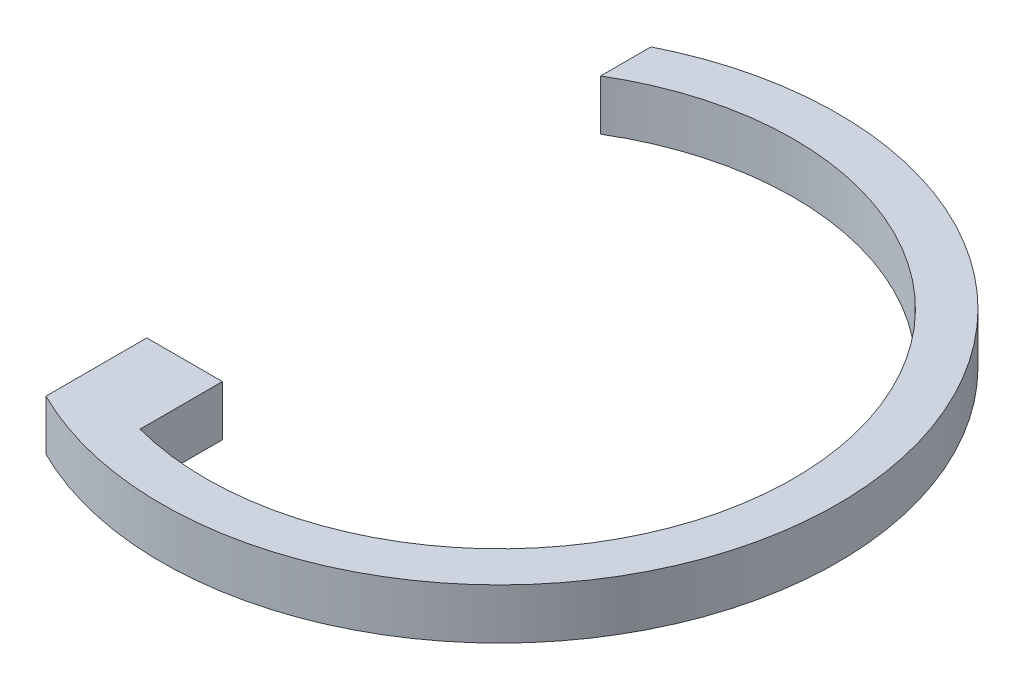
ISO-10303-21;
HEADER;
FILE_DESCRIPTION(('STEP AP214'),'2;1');
FILE_NAME('part.step','',(''),(''),'','','');
FILE_SCHEMA(('AUTOMOTIVE_DESIGN { 1 0 10303 214 1 1 1 1 }'));
ENDSEC;
DATA;
#1=APPLICATION_CONTEXT('core data for automotive mechanical design processes');
#2=APPLICATION_PROTOCOL_DEFINITION('international standard','automotive_design',2000,#1);
#3=PRODUCT_CONTEXT('',#1,'mechanical');
#4=PRODUCT('Part','Part','',(#3));
#5=PRODUCT_RELATED_PRODUCT_CATEGORY('part','',(#4));
#6=PRODUCT_DEFINITION_FORMATION('','',#4);
#7=PRODUCT_DEFINITION_CONTEXT('part definition',#1,'design');
#8=PRODUCT_DEFINITION('design','',#6,#7);
#9=PRODUCT_DEFINITION_SHAPE('','',#8);
#10=(LENGTH_UNIT() NAMED_UNIT(*) SI_UNIT(.MILLI.,.METRE.));
#11=(NAMED_UNIT(*) PLANE_ANGLE_UNIT() SI_UNIT($,.RADIAN.));
#12=(NAMED_UNIT(*) SI_UNIT($,.STERADIAN.) SOLID_ANGLE_UNIT());
#13=UNCERTAINTY_MEASURE_WITH_UNIT(LENGTH_MEASURE(1.E-05),#10,'distance_accuracy_value','');
#14=(GEOMETRIC_REPRESENTATION_CONTEXT(3) GLOBAL_UNCERTAINTY_ASSIGNED_CONTEXT((#13)) GLOBAL_UNIT_ASSIGNED_CONTEXT((#10,
#11,#12)) REPRESENTATION_CONTEXT('',''));
#15=CARTESIAN_POINT('',(0.,0.,0.));
#16=DIRECTION('',(0.,0.,1.));
#17=DIRECTION('',(1.,0.,0.));
#18=AXIS2_PLACEMENT_3D('',#15,#16,#17);
#19=CARTESIAN_POINT('',(10.,-10.,0.));
#20=DIRECTION('',(0.,1.,0.));
#21=DIRECTION('',(0.,0.,1.));
#22=AXIS2_PLACEMENT_3D('',#19,#20,#21);
#23=CYLINDRICAL_SURFACE('',#22,58.309518948453);
#24=CARTESIAN_POINT('',(10.,-10.,0.));
#25=DIRECTION('',(0.,-1.,0.));
#26=DIRECTION('',(0.,0.,-1.));
#27=AXIS2_PLACEMENT_3D('',#24,#25,#26);
#28=CIRCLE('',#27,58.309518948453);
#29=CARTESIAN_POINT('',(-20.,-10.,-50.));
#30=VERTEX_POINT('',#29);
#31=CARTESIAN_POINT('',(-4.99999999999992,-10.,56.3471383479233));
#32=VERTEX_POINT('',#31);
#33=EDGE_CURVE('E49',#30,#32,#28,.T.);
#34=ORIENTED_EDGE('',*,*,#33,.T.);
#35=DIRECTION('',(0.,1.,0.));
#36=VECTOR('',#35,1.);
#37=CARTESIAN_POINT('',(-4.99999999999992,-10.,56.3471383479233));
#38=LINE('',#37,#36);
#39=CARTESIAN_POINT('',(-4.99999999999992,0.,56.3471383479233));
#40=VERTEX_POINT('',#39);
#41=EDGE_CURVE('E53',#32,#40,#38,.T.);
#42=ORIENTED_EDGE('',*,*,#41,.T.);
#43=CARTESIAN_POINT('',(10.,0.,0.));
#44=DIRECTION('',(0.,-1.,0.));
#45=DIRECTION('',(0.,0.,-1.));
#46=AXIS2_PLACEMENT_3D('',#43,#44,#45);
#47=CIRCLE('',#46,58.309518948453);
#48=CARTESIAN_POINT('',(-20.,0.,-50.));
#49=VERTEX_POINT('',#48);
#50=EDGE_CURVE('E92',#49,#40,#47,.T.);
#51=ORIENTED_EDGE('',*,*,#50,.F.);
#52=DIRECTION('',(0.,1.,0.));
#53=VECTOR('',#52,1.);
#54=CARTESIAN_POINT('',(-20.,-10.,-50.));
#55=LINE('',#54,#53);
#56=EDGE_CURVE('E11',#30,#49,#55,.T.);
#57=ORIENTED_EDGE('',*,*,#56,.F.);
#58=EDGE_LOOP('',(#34,#42,#51,#57));
#59=FACE_BOUND('',#58,.T.);
#60=ADVANCED_FACE('F33',(#59),#23,.F.);
#61=CARTESIAN_POINT('',(-20.,-10.,-50.));
#62=DIRECTION('',(-1.,0.,0.));
#63=DIRECTION('',(0.,0.,1.));
#64=AXIS2_PLACEMENT_3D('',#61,#62,#63);
#65=PLANE('',#64);
#66=DIRECTION('',(0.,0.,1.));
#67=VECTOR('',#66,1.);
#68=CARTESIAN_POINT('',(-20.,0.,-50.));
#69=LINE('',#68,#67);
#70=CARTESIAN_POINT('',(-20.,0.,-60.));
#71=VERTEX_POINT('',#70);
#72=EDGE_CURVE('E117',#71,#49,#69,.T.);
#73=ORIENTED_EDGE('',*,*,#72,.F.);
#74=DIRECTION('',(0.,1.,0.));
#75=VECTOR('',#74,1.);
#76=CARTESIAN_POINT('',(-20.,-10.,-60.));
#77=LINE('',#76,#75);
#78=CARTESIAN_POINT('',(-20.,-10.,-60.));
#79=VERTEX_POINT('',#78);
#80=EDGE_CURVE('E41',#79,#71,#77,.T.);
#81=ORIENTED_EDGE('',*,*,#80,.F.);
#82=DIRECTION('',(0.,0.,1.));
#83=VECTOR('',#82,1.);
#84=CARTESIAN_POINT('',(-20.,-10.,-50.));
#85=LINE('',#84,#83);
#86=EDGE_CURVE('E123',#79,#30,#85,.T.);
#87=ORIENTED_EDGE('',*,*,#86,.T.);
#88=ORIENTED_EDGE('',*,*,#56,.T.);
#89=EDGE_LOOP('',(#73,#81,#87,#88));
#90=FACE_BOUND('',#89,.T.);
#91=ADVANCED_FACE('F140',(#90),#65,.T.);
#92=CARTESIAN_POINT('',(10.,-10.,0.));
#93=DIRECTION('',(0.,1.,0.));
#94=DIRECTION('',(0.,0.,1.));
#95=AXIS2_PLACEMENT_3D('',#92,#93,#94);
#96=CYLINDRICAL_SURFACE('',#95,67.0820393249937);
#97=CARTESIAN_POINT('',(10.,0.,0.));
#98=DIRECTION('',(0.,1.,0.));
#99=DIRECTION('',(0.,0.,-1.));
#100=AXIS2_PLACEMENT_3D('',#97,#98,#99);
#101=CIRCLE('',#100,67.0820393249937);
#102=CARTESIAN_POINT('',(-19.9999999999999,0.,60.0000000000001));
#103=VERTEX_POINT('',#102);
#104=EDGE_CURVE('E129',#103,#71,#101,.T.);
#105=ORIENTED_EDGE('',*,*,#104,.F.);
#106=DIRECTION('',(0.,1.,0.));
#107=VECTOR('',#106,1.);
#108=CARTESIAN_POINT('',(-19.9999999999999,-10.,60.0000000000001));
#109=LINE('',#108,#107);
#110=CARTESIAN_POINT('',(-19.9999999999999,-10.,60.0000000000001));
#111=VERTEX_POINT('',#110);
#112=EDGE_CURVE('E36',#111,#103,#109,.T.);
#113=ORIENTED_EDGE('',*,*,#112,.F.);
#114=CARTESIAN_POINT('',(10.,-10.,0.));
#115=DIRECTION('',(0.,1.,0.));
#116=DIRECTION('',(0.,0.,-1.));
#117=AXIS2_PLACEMENT_3D('',#114,#115,#116);
#118=CIRCLE('',#117,67.0820393249937);
#119=EDGE_CURVE('E120',#111,#79,#118,.T.);
#120=ORIENTED_EDGE('',*,*,#119,.T.);
#121=ORIENTED_EDGE('',*,*,#80,.T.);
#122=EDGE_LOOP('',(#105,#113,#120,#121));
#123=FACE_BOUND('',#122,.T.);
#124=ADVANCED_FACE('F137',(#123),#96,.T.);
#125=CARTESIAN_POINT('',(-20.,-10.,50.));
#126=DIRECTION('',(-1.,0.,0.));
#127=DIRECTION('',(0.,0.,1.));
#128=AXIS2_PLACEMENT_3D('',#125,#126,#127);
#129=PLANE('',#128);
#130=DIRECTION('',(0.,0.,1.));
#131=VECTOR('',#130,1.);
#132=CARTESIAN_POINT('',(-20.,0.,50.));
#133=LINE('',#132,#131);
#134=CARTESIAN_POINT('',(-19.9999999999999,0.,40.));
#135=VERTEX_POINT('',#134);
#136=EDGE_CURVE('E127',#135,#103,#133,.T.);
#137=ORIENTED_EDGE('',*,*,#136,.F.);
#138=DIRECTION('',(0.,-1.,0.));
#139=VECTOR('',#138,1.);
#140=CARTESIAN_POINT('',(-19.9999999999999,-10.,40.));
#141=LINE('',#140,#139);
#142=CARTESIAN_POINT('',(-19.9999999999999,-10.,40.));
#143=VERTEX_POINT('',#142);
#144=EDGE_CURVE('E96',#135,#143,#141,.T.);
#145=ORIENTED_EDGE('',*,*,#144,.T.);
#146=DIRECTION('',(0.,0.,1.));
#147=VECTOR('',#146,1.);
#148=CARTESIAN_POINT('',(-20.,-10.,50.));
#149=LINE('',#148,#147);
#150=EDGE_CURVE('E116',#143,#111,#149,.T.);
#151=ORIENTED_EDGE('',*,*,#150,.T.);
#152=ORIENTED_EDGE('',*,*,#112,.T.);
#153=EDGE_LOOP('',(#137,#145,#151,#152));
#154=FACE_BOUND('',#153,.T.);
#155=ADVANCED_FACE('F135',(#154),#129,.T.);
#156=CARTESIAN_POINT('',(10.,-10.,0.));
#157=DIRECTION('',(0.,-1.,0.));
#158=DIRECTION('',(0.,0.,-1.));
#159=AXIS2_PLACEMENT_3D('',#156,#157,#158);
#160=PLANE('',#159);
#161=ORIENTED_EDGE('',*,*,#119,.F.);
#162=ORIENTED_EDGE('',*,*,#150,.F.);
#163=DIRECTION('',(-1.,0.,0.));
#164=VECTOR('',#163,1.);
#165=CARTESIAN_POINT('',(-4.99999999999994,-10.,40.));
#166=LINE('',#165,#164);
#167=CARTESIAN_POINT('',(-4.99999999999994,-10.,40.));
#168=VERTEX_POINT('',#167);
#169=EDGE_CURVE('E104',#168,#143,#166,.T.);
#170=ORIENTED_EDGE('',*,*,#169,.F.);
#171=DIRECTION('',(0.,0.,1.));
#172=VECTOR('',#171,1.);
#173=CARTESIAN_POINT('',(-4.99999999999991,-10.,60.));
#174=LINE('',#173,#172);
#175=EDGE_CURVE('E105',#168,#32,#174,.T.);
#176=ORIENTED_EDGE('',*,*,#175,.T.);
#177=ORIENTED_EDGE('',*,*,#33,.F.);
#178=ORIENTED_EDGE('',*,*,#86,.F.);
#179=EDGE_LOOP('',(#161,#162,#170,#176,#177,#178));
#180=FACE_BOUND('',#179,.T.);
#181=ADVANCED_FACE('F154',(#180),#160,.T.);
#182=CARTESIAN_POINT('',(10.,0.,0.));
#183=DIRECTION('',(0.,-1.,0.));
#184=DIRECTION('',(0.,0.,-1.));
#185=AXIS2_PLACEMENT_3D('',#182,#183,#184);
#186=PLANE('',#185);
#187=ORIENTED_EDGE('',*,*,#136,.T.);
#188=ORIENTED_EDGE('',*,*,#104,.T.);
#189=ORIENTED_EDGE('',*,*,#72,.T.);
#190=ORIENTED_EDGE('',*,*,#50,.T.);
#191=DIRECTION('',(0.,0.,-1.));
#192=VECTOR('',#191,1.);
#193=CARTESIAN_POINT('',(-4.99999999999991,0.,60.));
#194=LINE('',#193,#192);
#195=CARTESIAN_POINT('',(-4.99999999999994,0.,40.));
#196=VERTEX_POINT('',#195);
#197=EDGE_CURVE('E85',#40,#196,#194,.T.);
#198=ORIENTED_EDGE('',*,*,#197,.T.);
#199=DIRECTION('',(-1.,0.,0.));
#200=VECTOR('',#199,1.);
#201=CARTESIAN_POINT('',(-4.99999999999994,0.,40.));
#202=LINE('',#201,#200);
#203=EDGE_CURVE('E89',#196,#135,#202,.T.);
#204=ORIENTED_EDGE('',*,*,#203,.T.);
#205=EDGE_LOOP('',(#187,#188,#189,#190,#198,#204));
#206=FACE_BOUND('',#205,.T.);
#207=ADVANCED_FACE('F88',(#206),#186,.F.);
#208=CARTESIAN_POINT('',(-4.99999999999994,-10.,40.));
#209=DIRECTION('',(0.,0.,-1.));
#210=DIRECTION('',(-1.,0.,0.));
#211=AXIS2_PLACEMENT_3D('',#208,#209,#210);
#212=PLANE('',#211);
#213=ORIENTED_EDGE('',*,*,#144,.F.);
#214=ORIENTED_EDGE('',*,*,#203,.F.);
#215=DIRECTION('',(0.,-1.,0.));
#216=VECTOR('',#215,1.);
#217=CARTESIAN_POINT('',(-4.99999999999994,-10.,40.));
#218=LINE('',#217,#216);
#219=EDGE_CURVE('E95',#196,#168,#218,.T.);
#220=ORIENTED_EDGE('',*,*,#219,.T.);
#221=ORIENTED_EDGE('',*,*,#169,.T.);
#222=EDGE_LOOP('',(#213,#214,#220,#221));
#223=FACE_BOUND('',#222,.T.);
#224=ADVANCED_FACE('F100',(#223),#212,.T.);
#225=CARTESIAN_POINT('',(-4.99999999999999,0.,0.));
#226=DIRECTION('',(-1.,0.,0.));
#227=DIRECTION('',(0.,0.,1.));
#228=AXIS2_PLACEMENT_3D('',#225,#226,#227);
#229=PLANE('',#228);
#230=ORIENTED_EDGE('',*,*,#41,.F.);
#231=ORIENTED_EDGE('',*,*,#175,.F.);
#232=ORIENTED_EDGE('',*,*,#219,.F.);
#233=ORIENTED_EDGE('',*,*,#197,.F.);
#234=EDGE_LOOP('',(#230,#231,#232,#233));
#235=FACE_BOUND('',#234,.T.);
#236=ADVANCED_FACE('F107',(#235),#229,.F.);
#237=CLOSED_SHELL('',(#60,#91,#124,#155,#181,#207,#224,#236));
#238=MANIFOLD_SOLID_BREP('B2',#237);
#239=ADVANCED_BREP_SHAPE_REPRESENTATION('',(#18,#238),#14);
#240=SHAPE_DEFINITION_REPRESENTATION(#9,#239);
ENDSEC;
END-ISO-10303-21;
